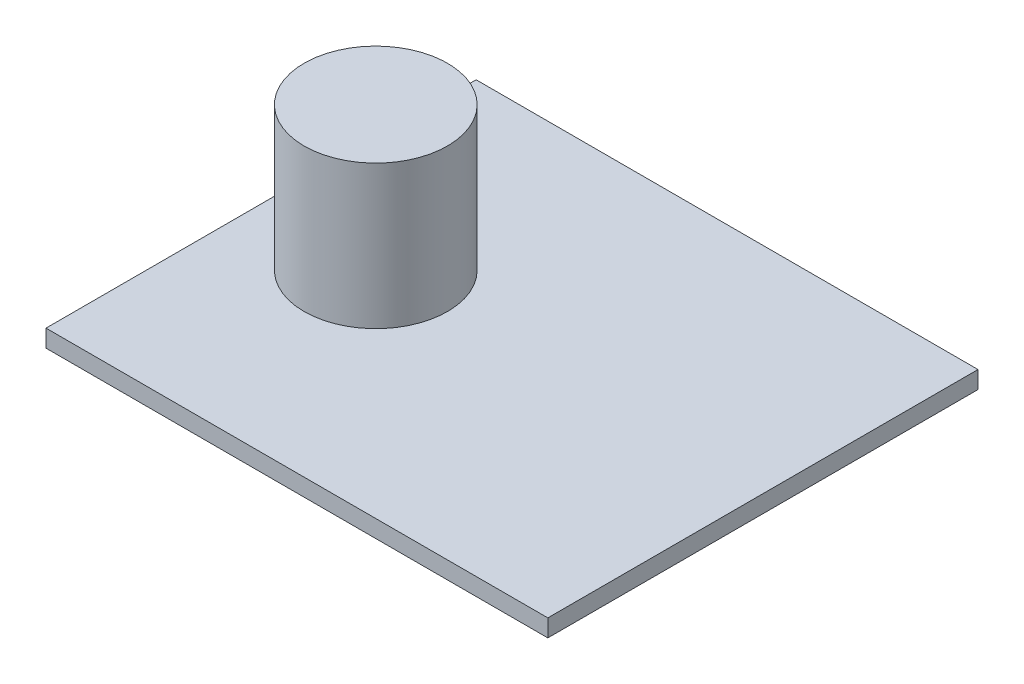
ISO-10303-21;
HEADER;
FILE_DESCRIPTION(('STEP AP214'),'2;1');
FILE_NAME('part.step','',(''),(''),'','','');
FILE_SCHEMA(('AUTOMOTIVE_DESIGN { 1 0 10303 214 1 1 1 1 }'));
ENDSEC;
DATA;
#1=APPLICATION_CONTEXT('core data for automotive mechanical design processes');
#2=APPLICATION_PROTOCOL_DEFINITION('international standard','automotive_design',2000,#1);
#3=PRODUCT_CONTEXT('',#1,'mechanical');
#4=PRODUCT('Part','Part','',(#3));
#5=PRODUCT_RELATED_PRODUCT_CATEGORY('part','',(#4));
#6=PRODUCT_DEFINITION_FORMATION('','',#4);
#7=PRODUCT_DEFINITION_CONTEXT('part definition',#1,'design');
#8=PRODUCT_DEFINITION('design','',#6,#7);
#9=PRODUCT_DEFINITION_SHAPE('','',#8);
#10=(LENGTH_UNIT() NAMED_UNIT(*) SI_UNIT(.MILLI.,.METRE.));
#11=(NAMED_UNIT(*) PLANE_ANGLE_UNIT() SI_UNIT($,.RADIAN.));
#12=(NAMED_UNIT(*) SI_UNIT($,.STERADIAN.) SOLID_ANGLE_UNIT());
#13=UNCERTAINTY_MEASURE_WITH_UNIT(LENGTH_MEASURE(1.E-05),#10,'distance_accuracy_value','');
#14=(GEOMETRIC_REPRESENTATION_CONTEXT(3) GLOBAL_UNCERTAINTY_ASSIGNED_CONTEXT((#13)) GLOBAL_UNIT_ASSIGNED_CONTEXT((#10,
#11,#12)) REPRESENTATION_CONTEXT('',''));
#15=CARTESIAN_POINT('',(0.,0.,0.));
#16=DIRECTION('',(0.,0.,1.));
#17=DIRECTION('',(1.,0.,0.));
#18=AXIS2_PLACEMENT_3D('',#15,#16,#17);
#19=CARTESIAN_POINT('',(-113.086674099458,1.53924,1.03614054383309));
#20=DIRECTION('',(0.,1.,0.));
#21=DIRECTION('',(0.,0.,1.));
#22=AXIS2_PLACEMENT_3D('',#19,#20,#21);
#23=PLANE('',#22);
#24=DIRECTION('',(1.,0.,0.));
#25=VECTOR('',#24,1.);
#26=CARTESIAN_POINT('',(-113.086674099458,1.53924,-37.0638594561669));
#27=LINE('',#26,#25);
#28=CARTESIAN_POINT('',(-99.2127644758232,1.53924,-37.0638594561669));
#29=VERTEX_POINT('',#28);
#30=CARTESIAN_POINT('',(-54.7627644758232,1.53924,-37.0638594561669));
#31=VERTEX_POINT('',#30);
#32=EDGE_CURVE('E82',#29,#31,#27,.T.);
#33=ORIENTED_EDGE('',*,*,#32,.F.);
#34=DIRECTION('',(0.,0.,-1.));
#35=VECTOR('',#34,1.);
#36=CARTESIAN_POINT('',(-99.2127644758232,1.53924,1.03614054383309));
#37=LINE('',#36,#35);
#38=CARTESIAN_POINT('',(-99.2127644758232,1.53924,1.03614054383309));
#39=VERTEX_POINT('',#38);
#40=EDGE_CURVE('E78',#39,#29,#37,.T.);
#41=ORIENTED_EDGE('',*,*,#40,.F.);
#42=DIRECTION('',(1.,0.,0.));
#43=VECTOR('',#42,1.);
#44=CARTESIAN_POINT('',(-113.086674099458,1.53924,1.03614054383309));
#45=LINE('',#44,#43);
#46=CARTESIAN_POINT('',(-54.7627644758232,1.53924,1.03614054383309));
#47=VERTEX_POINT('',#46);
#48=EDGE_CURVE('E81',#39,#47,#45,.T.);
#49=ORIENTED_EDGE('',*,*,#48,.T.);
#50=DIRECTION('',(0.,0.,-1.));
#51=VECTOR('',#50,1.);
#52=CARTESIAN_POINT('',(-54.7627644758232,1.53924,1.03614054383309));
#53=LINE('',#52,#51);
#54=EDGE_CURVE('E53',#47,#31,#53,.T.);
#55=ORIENTED_EDGE('',*,*,#54,.T.);
#56=EDGE_LOOP('',(#33,#41,#49,#55));
#57=FACE_BOUND('',#56,.T.);
#58=CARTESIAN_POINT('',(-89.0527644758232,1.53924,-18.0138594561669));
#59=DIRECTION('',(0.,1.,0.));
#60=DIRECTION('',(0.,0.,1.));
#61=AXIS2_PLACEMENT_3D('',#58,#59,#60);
#62=CIRCLE('',#61,6.35);
#63=CARTESIAN_POINT('',(-89.0527644758232,1.53924,-11.6638594561669));
#64=VERTEX_POINT('',#63);
#65=EDGE_CURVE('E120',#64,#64,#62,.T.);
#66=ORIENTED_EDGE('',*,*,#65,.F.);
#67=EDGE_LOOP('',(#66));
#68=FACE_BOUND('',#67,.T.);
#69=ADVANCED_FACE('F38',(#57,#68),#23,.T.);
#70=CARTESIAN_POINT('',(-99.2127644758232,12.7,-37.0638594561669));
#71=DIRECTION('',(1.,0.,0.));
#72=DIRECTION('',(0.,0.,-1.));
#73=AXIS2_PLACEMENT_3D('',#70,#71,#72);
#74=PLANE('',#73);
#75=ORIENTED_EDGE('',*,*,#40,.T.);
#76=DIRECTION('',(0.,-1.,0.));
#77=VECTOR('',#76,1.);
#78=CARTESIAN_POINT('',(-99.2127644758232,12.7,-37.0638594561669));
#79=LINE('',#78,#77);
#80=CARTESIAN_POINT('',(-99.2127644758232,0.,-37.0638594561669));
#81=VERTEX_POINT('',#80);
#82=EDGE_CURVE('E61',#29,#81,#79,.T.);
#83=ORIENTED_EDGE('',*,*,#82,.T.);
#84=DIRECTION('',(0.,0.,1.));
#85=VECTOR('',#84,1.);
#86=CARTESIAN_POINT('',(-99.2127644758232,0.,-37.0638594561669));
#87=LINE('',#86,#85);
#88=CARTESIAN_POINT('',(-99.2127644758232,0.,1.03614054383309));
#89=VERTEX_POINT('',#88);
#90=EDGE_CURVE('E92',#81,#89,#87,.T.);
#91=ORIENTED_EDGE('',*,*,#90,.T.);
#92=DIRECTION('',(0.,-1.,0.));
#93=VECTOR('',#92,1.);
#94=CARTESIAN_POINT('',(-99.2127644758232,12.7,1.03614054383309));
#95=LINE('',#94,#93);
#96=EDGE_CURVE('E11',#39,#89,#95,.T.);
#97=ORIENTED_EDGE('',*,*,#96,.F.);
#98=EDGE_LOOP('',(#75,#83,#91,#97));
#99=FACE_BOUND('',#98,.T.);
#100=ADVANCED_FACE('F40',(#99),#74,.F.);
#101=CARTESIAN_POINT('',(-99.2127644758232,12.7,1.03614054383309));
#102=DIRECTION('',(0.,0.,-1.));
#103=DIRECTION('',(-1.,0.,0.));
#104=AXIS2_PLACEMENT_3D('',#101,#102,#103);
#105=PLANE('',#104);
#106=ORIENTED_EDGE('',*,*,#48,.F.);
#107=ORIENTED_EDGE('',*,*,#96,.T.);
#108=DIRECTION('',(1.,0.,0.));
#109=VECTOR('',#108,1.);
#110=CARTESIAN_POINT('',(-99.2127644758232,0.,1.03614054383309));
#111=LINE('',#110,#109);
#112=CARTESIAN_POINT('',(-54.7627644758232,0.,1.03614054383309));
#113=VERTEX_POINT('',#112);
#114=EDGE_CURVE('E95',#89,#113,#111,.T.);
#115=ORIENTED_EDGE('',*,*,#114,.T.);
#116=DIRECTION('',(0.,-1.,0.));
#117=VECTOR('',#116,1.);
#118=CARTESIAN_POINT('',(-54.7627644758232,12.7,1.03614054383309));
#119=LINE('',#118,#117);
#120=EDGE_CURVE('E46',#47,#113,#119,.T.);
#121=ORIENTED_EDGE('',*,*,#120,.F.);
#122=EDGE_LOOP('',(#106,#107,#115,#121));
#123=FACE_BOUND('',#122,.T.);
#124=ADVANCED_FACE('F87',(#123),#105,.F.);
#125=CARTESIAN_POINT('',(-54.7627644758232,12.7,-37.0638594561669));
#126=DIRECTION('',(-1.,0.,0.));
#127=DIRECTION('',(0.,0.,1.));
#128=AXIS2_PLACEMENT_3D('',#125,#126,#127);
#129=PLANE('',#128);
#130=ORIENTED_EDGE('',*,*,#54,.F.);
#131=ORIENTED_EDGE('',*,*,#120,.T.);
#132=DIRECTION('',(0.,0.,-1.));
#133=VECTOR('',#132,1.);
#134=CARTESIAN_POINT('',(-54.7627644758232,0.,-37.0638594561669));
#135=LINE('',#134,#133);
#136=CARTESIAN_POINT('',(-54.7627644758232,0.,-37.0638594561669));
#137=VERTEX_POINT('',#136);
#138=EDGE_CURVE('E97',#113,#137,#135,.T.);
#139=ORIENTED_EDGE('',*,*,#138,.T.);
#140=DIRECTION('',(0.,-1.,0.));
#141=VECTOR('',#140,1.);
#142=CARTESIAN_POINT('',(-54.7627644758232,12.7,-37.0638594561669));
#143=LINE('',#142,#141);
#144=EDGE_CURVE('E108',#31,#137,#143,.T.);
#145=ORIENTED_EDGE('',*,*,#144,.F.);
#146=EDGE_LOOP('',(#130,#131,#139,#145));
#147=FACE_BOUND('',#146,.T.);
#148=ADVANCED_FACE('F111',(#147),#129,.F.);
#149=CARTESIAN_POINT('',(-99.2127644758232,12.7,-37.0638594561669));
#150=DIRECTION('',(0.,0.,1.));
#151=DIRECTION('',(1.,0.,0.));
#152=AXIS2_PLACEMENT_3D('',#149,#150,#151);
#153=PLANE('',#152);
#154=ORIENTED_EDGE('',*,*,#32,.T.);
#155=ORIENTED_EDGE('',*,*,#144,.T.);
#156=DIRECTION('',(-1.,0.,0.));
#157=VECTOR('',#156,1.);
#158=CARTESIAN_POINT('',(-99.2127644758232,0.,-37.0638594561669));
#159=LINE('',#158,#157);
#160=EDGE_CURVE('E104',#137,#81,#159,.T.);
#161=ORIENTED_EDGE('',*,*,#160,.T.);
#162=ORIENTED_EDGE('',*,*,#82,.F.);
#163=EDGE_LOOP('',(#154,#155,#161,#162));
#164=FACE_BOUND('',#163,.T.);
#165=ADVANCED_FACE('F116',(#164),#153,.F.);
#166=CARTESIAN_POINT('',(-99.2127644758232,0.,1.03614054383309));
#167=DIRECTION('',(0.,1.,0.));
#168=DIRECTION('',(0.,0.,1.));
#169=AXIS2_PLACEMENT_3D('',#166,#167,#168);
#170=PLANE('',#169);
#171=ORIENTED_EDGE('',*,*,#90,.F.);
#172=ORIENTED_EDGE('',*,*,#160,.F.);
#173=ORIENTED_EDGE('',*,*,#138,.F.);
#174=ORIENTED_EDGE('',*,*,#114,.F.);
#175=EDGE_LOOP('',(#171,#172,#173,#174));
#176=FACE_BOUND('',#175,.T.);
#177=ADVANCED_FACE('F114',(#176),#170,.F.);
#178=CARTESIAN_POINT('',(-89.0527644758232,14.23924,-18.0138594561669));
#179=DIRECTION('',(0.,-1.,0.));
#180=DIRECTION('',(0.,0.,-1.));
#181=AXIS2_PLACEMENT_3D('',#178,#179,#180);
#182=CYLINDRICAL_SURFACE('',#181,6.35);
#183=CARTESIAN_POINT('',(-89.0527644758232,14.23924,-18.0138594561669));
#184=DIRECTION('',(0.,1.,0.));
#185=DIRECTION('',(0.,0.,1.));
#186=AXIS2_PLACEMENT_3D('',#183,#184,#185);
#187=CIRCLE('',#186,6.35);
#188=CARTESIAN_POINT('',(-89.0527644758232,14.23924,-11.6638594561669));
#189=VERTEX_POINT('',#188);
#190=EDGE_CURVE('E117',#189,#189,#187,.T.);
#191=ORIENTED_EDGE('',*,*,#190,.F.);
#192=EDGE_LOOP('',(#191));
#193=FACE_BOUND('',#192,.T.);
#194=ORIENTED_EDGE('',*,*,#65,.T.);
#195=EDGE_LOOP('',(#194));
#196=FACE_BOUND('',#195,.T.);
#197=ADVANCED_FACE('F126',(#193,#196),#182,.T.);
#198=CARTESIAN_POINT('',(-122.665814632401,14.23924,-18.0138594561669));
#199=DIRECTION('',(0.,1.,0.));
#200=DIRECTION('',(0.,0.,1.));
#201=AXIS2_PLACEMENT_3D('',#198,#199,#200);
#202=PLANE('',#201);
#203=ORIENTED_EDGE('',*,*,#190,.T.);
#204=EDGE_LOOP('',(#203));
#205=FACE_BOUND('',#204,.T.);
#206=ADVANCED_FACE('F163',(#205),#202,.T.);
#207=CLOSED_SHELL('',(#69,#100,#124,#148,#165,#177,#197,#206));
#208=MANIFOLD_SOLID_BREP('B2',#207);
#209=ADVANCED_BREP_SHAPE_REPRESENTATION('',(#18,#208),#14);
#210=SHAPE_DEFINITION_REPRESENTATION(#9,#209);
ENDSEC;
END-ISO-10303-21;
